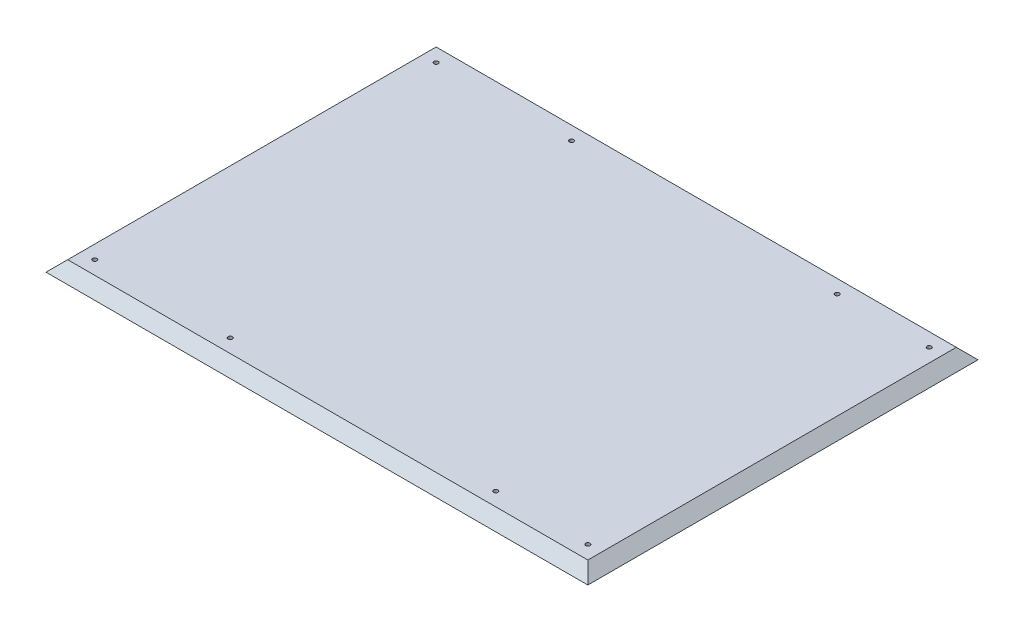
ISO-10303-21;
HEADER;
FILE_DESCRIPTION(('STEP AP214'),'2;1');
FILE_NAME('part.step','',(''),(''),'','','');
FILE_SCHEMA(('AUTOMOTIVE_DESIGN { 1 0 10303 214 1 1 1 1 }'));
ENDSEC;
DATA;
#1=APPLICATION_CONTEXT('core data for automotive mechanical design processes');
#2=APPLICATION_PROTOCOL_DEFINITION('international standard','automotive_design',2000,#1);
#3=PRODUCT_CONTEXT('',#1,'mechanical');
#4=PRODUCT('Part','Part','',(#3));
#5=PRODUCT_RELATED_PRODUCT_CATEGORY('part','',(#4));
#6=PRODUCT_DEFINITION_FORMATION('','',#4);
#7=PRODUCT_DEFINITION_CONTEXT('part definition',#1,'design');
#8=PRODUCT_DEFINITION('design','',#6,#7);
#9=PRODUCT_DEFINITION_SHAPE('','',#8);
#10=(LENGTH_UNIT() NAMED_UNIT(*) SI_UNIT(.MILLI.,.METRE.));
#11=(NAMED_UNIT(*) PLANE_ANGLE_UNIT() SI_UNIT($,.RADIAN.));
#12=(NAMED_UNIT(*) SI_UNIT($,.STERADIAN.) SOLID_ANGLE_UNIT());
#13=UNCERTAINTY_MEASURE_WITH_UNIT(LENGTH_MEASURE(1.E-05),#10,'distance_accuracy_value','');
#14=(GEOMETRIC_REPRESENTATION_CONTEXT(3) GLOBAL_UNCERTAINTY_ASSIGNED_CONTEXT((#13)) GLOBAL_UNIT_ASSIGNED_CONTEXT((#10,
#11,#12)) REPRESENTATION_CONTEXT('',''));
#15=CARTESIAN_POINT('',(0.,0.,0.));
#16=DIRECTION('',(0.,0.,1.));
#17=DIRECTION('',(1.,0.,0.));
#18=AXIS2_PLACEMENT_3D('',#15,#16,#17);
#19=CARTESIAN_POINT('',(0.,20.,0.));
#20=DIRECTION('',(0.,1.,0.));
#21=DIRECTION('',(0.,0.,1.));
#22=AXIS2_PLACEMENT_3D('',#19,#20,#21);
#23=PLANE('',#22);
#24=CARTESIAN_POINT('',(-102.5,20.,-157.5));
#25=DIRECTION('',(0.,1.,0.));
#26=DIRECTION('',(0.,0.,1.));
#27=AXIS2_PLACEMENT_3D('',#24,#25,#26);
#28=CIRCLE('',#27,2.);
#29=CARTESIAN_POINT('',(-102.5,20.,-155.5));
#30=VERTEX_POINT('',#29);
#31=EDGE_CURVE('E324',#30,#30,#28,.T.);
#32=ORIENTED_EDGE('',*,*,#31,.F.);
#33=EDGE_LOOP('',(#32));
#34=FACE_BOUND('',#33,.T.);
#35=CARTESIAN_POINT('',(142.5,20.,-157.5));
#36=DIRECTION('',(0.,1.,0.));
#37=DIRECTION('',(0.,0.,1.));
#38=AXIS2_PLACEMENT_3D('',#35,#36,#37);
#39=CIRCLE('',#38,2.);
#40=CARTESIAN_POINT('',(142.5,20.,-155.5));
#41=VERTEX_POINT('',#40);
#42=EDGE_CURVE('E329',#41,#41,#39,.T.);
#43=ORIENTED_EDGE('',*,*,#42,.F.);
#44=EDGE_LOOP('',(#43));
#45=FACE_BOUND('',#44,.T.);
#46=CARTESIAN_POINT('',(227.5,20.,-157.5));
#47=DIRECTION('',(0.,1.,0.));
#48=DIRECTION('',(0.,0.,1.));
#49=AXIS2_PLACEMENT_3D('',#46,#47,#48);
#50=CIRCLE('',#49,2.);
#51=CARTESIAN_POINT('',(227.5,20.,-155.5));
#52=VERTEX_POINT('',#51);
#53=EDGE_CURVE('E337',#52,#52,#50,.T.);
#54=ORIENTED_EDGE('',*,*,#53,.F.);
#55=EDGE_LOOP('',(#54));
#56=FACE_BOUND('',#55,.T.);
#57=CARTESIAN_POINT('',(227.5,20.,157.5));
#58=DIRECTION('',(0.,1.,0.));
#59=DIRECTION('',(0.,0.,1.));
#60=AXIS2_PLACEMENT_3D('',#57,#58,#59);
#61=CIRCLE('',#60,2.);
#62=CARTESIAN_POINT('',(227.5,20.,159.5));
#63=VERTEX_POINT('',#62);
#64=EDGE_CURVE('E343',#63,#63,#61,.T.);
#65=ORIENTED_EDGE('',*,*,#64,.F.);
#66=EDGE_LOOP('',(#65));
#67=FACE_BOUND('',#66,.T.);
#68=CARTESIAN_POINT('',(142.5,20.,157.5));
#69=DIRECTION('',(0.,1.,0.));
#70=DIRECTION('',(0.,0.,1.));
#71=AXIS2_PLACEMENT_3D('',#68,#69,#70);
#72=CIRCLE('',#71,2.);
#73=CARTESIAN_POINT('',(142.5,20.,159.5));
#74=VERTEX_POINT('',#73);
#75=EDGE_CURVE('E349',#74,#74,#72,.T.);
#76=ORIENTED_EDGE('',*,*,#75,.F.);
#77=EDGE_LOOP('',(#76));
#78=FACE_BOUND('',#77,.T.);
#79=CARTESIAN_POINT('',(-102.5,20.,157.5));
#80=DIRECTION('',(0.,1.,0.));
#81=DIRECTION('',(0.,0.,1.));
#82=AXIS2_PLACEMENT_3D('',#79,#80,#81);
#83=CIRCLE('',#82,2.);
#84=CARTESIAN_POINT('',(-102.5,20.,159.5));
#85=VERTEX_POINT('',#84);
#86=EDGE_CURVE('E355',#85,#85,#83,.T.);
#87=ORIENTED_EDGE('',*,*,#86,.F.);
#88=EDGE_LOOP('',(#87));
#89=FACE_BOUND('',#88,.T.);
#90=CARTESIAN_POINT('',(-227.5,20.,157.5));
#91=DIRECTION('',(0.,1.,0.));
#92=DIRECTION('',(0.,0.,1.));
#93=AXIS2_PLACEMENT_3D('',#90,#91,#92);
#94=CIRCLE('',#93,2.);
#95=CARTESIAN_POINT('',(-227.5,20.,159.5));
#96=VERTEX_POINT('',#95);
#97=EDGE_CURVE('E361',#96,#96,#94,.T.);
#98=ORIENTED_EDGE('',*,*,#97,.F.);
#99=EDGE_LOOP('',(#98));
#100=FACE_BOUND('',#99,.T.);
#101=CARTESIAN_POINT('',(-227.5,20.,-157.5));
#102=DIRECTION('',(0.,1.,0.));
#103=DIRECTION('',(0.,0.,1.));
#104=AXIS2_PLACEMENT_3D('',#101,#102,#103);
#105=CIRCLE('',#104,2.);
#106=CARTESIAN_POINT('',(-227.5,20.,-155.5));
#107=VERTEX_POINT('',#106);
#108=EDGE_CURVE('E143',#107,#107,#105,.T.);
#109=ORIENTED_EDGE('',*,*,#108,.F.);
#110=EDGE_LOOP('',(#109));
#111=FACE_BOUND('',#110,.T.);
#112=DIRECTION('',(0.,0.,1.));
#113=VECTOR('',#112,1.);
#114=CARTESIAN_POINT('',(-240.,20.,180.));
#115=LINE('',#114,#113);
#116=CARTESIAN_POINT('',(-240.,20.,-170.));
#117=VERTEX_POINT('',#116);
#118=CARTESIAN_POINT('',(-240.,20.,170.));
#119=VERTEX_POINT('',#118);
#120=EDGE_CURVE('E42',#117,#119,#115,.T.);
#121=ORIENTED_EDGE('',*,*,#120,.T.);
#122=DIRECTION('',(1.,0.,0.));
#123=VECTOR('',#122,1.);
#124=CARTESIAN_POINT('',(250.,20.,170.));
#125=LINE('',#124,#123);
#126=CARTESIAN_POINT('',(240.,20.,170.));
#127=VERTEX_POINT('',#126);
#128=EDGE_CURVE('E11',#119,#127,#125,.T.);
#129=ORIENTED_EDGE('',*,*,#128,.T.);
#130=DIRECTION('',(0.,0.,-1.));
#131=VECTOR('',#130,1.);
#132=CARTESIAN_POINT('',(240.,20.,-180.));
#133=LINE('',#132,#131);
#134=CARTESIAN_POINT('',(240.,20.,-170.));
#135=VERTEX_POINT('',#134);
#136=EDGE_CURVE('E92',#127,#135,#133,.T.);
#137=ORIENTED_EDGE('',*,*,#136,.T.);
#138=DIRECTION('',(-1.,0.,0.));
#139=VECTOR('',#138,1.);
#140=CARTESIAN_POINT('',(-250.,20.,-170.));
#141=LINE('',#140,#139);
#142=EDGE_CURVE('E95',#135,#117,#141,.T.);
#143=ORIENTED_EDGE('',*,*,#142,.T.);
#144=EDGE_LOOP('',(#121,#129,#137,#143));
#145=FACE_BOUND('',#144,.T.);
#146=ADVANCED_FACE('F32',(#34,#45,#56,#67,#78,#89,#100,#111,#145),#23,.T.);
#147=CARTESIAN_POINT('',(0.,0.,0.));
#148=DIRECTION('',(0.,1.,0.));
#149=DIRECTION('',(0.,0.,1.));
#150=AXIS2_PLACEMENT_3D('',#147,#148,#149);
#151=PLANE('',#150);
#152=CARTESIAN_POINT('',(-102.5,0.,-157.5));
#153=DIRECTION('',(0.,1.,0.));
#154=DIRECTION('',(0.,0.,1.));
#155=AXIS2_PLACEMENT_3D('',#152,#153,#154);
#156=CIRCLE('',#155,2.);
#157=CARTESIAN_POINT('',(-102.5,0.,-155.5));
#158=VERTEX_POINT('',#157);
#159=EDGE_CURVE('E322',#158,#158,#156,.T.);
#160=ORIENTED_EDGE('',*,*,#159,.T.);
#161=EDGE_LOOP('',(#160));
#162=FACE_BOUND('',#161,.T.);
#163=CARTESIAN_POINT('',(142.5,0.,-157.5));
#164=DIRECTION('',(0.,1.,0.));
#165=DIRECTION('',(0.,0.,1.));
#166=AXIS2_PLACEMENT_3D('',#163,#164,#165);
#167=CIRCLE('',#166,2.);
#168=CARTESIAN_POINT('',(142.5,0.,-155.5));
#169=VERTEX_POINT('',#168);
#170=EDGE_CURVE('E325',#169,#169,#167,.T.);
#171=ORIENTED_EDGE('',*,*,#170,.T.);
#172=EDGE_LOOP('',(#171));
#173=FACE_BOUND('',#172,.T.);
#174=CARTESIAN_POINT('',(227.5,0.,-157.5));
#175=DIRECTION('',(0.,1.,0.));
#176=DIRECTION('',(0.,0.,1.));
#177=AXIS2_PLACEMENT_3D('',#174,#175,#176);
#178=CIRCLE('',#177,2.);
#179=CARTESIAN_POINT('',(227.5,0.,-155.5));
#180=VERTEX_POINT('',#179);
#181=EDGE_CURVE('E334',#180,#180,#178,.T.);
#182=ORIENTED_EDGE('',*,*,#181,.T.);
#183=EDGE_LOOP('',(#182));
#184=FACE_BOUND('',#183,.T.);
#185=CARTESIAN_POINT('',(227.5,0.,157.5));
#186=DIRECTION('',(0.,1.,0.));
#187=DIRECTION('',(0.,0.,1.));
#188=AXIS2_PLACEMENT_3D('',#185,#186,#187);
#189=CIRCLE('',#188,2.);
#190=CARTESIAN_POINT('',(227.5,0.,159.5));
#191=VERTEX_POINT('',#190);
#192=EDGE_CURVE('E340',#191,#191,#189,.T.);
#193=ORIENTED_EDGE('',*,*,#192,.T.);
#194=EDGE_LOOP('',(#193));
#195=FACE_BOUND('',#194,.T.);
#196=CARTESIAN_POINT('',(142.5,0.,157.5));
#197=DIRECTION('',(0.,1.,0.));
#198=DIRECTION('',(0.,0.,1.));
#199=AXIS2_PLACEMENT_3D('',#196,#197,#198);
#200=CIRCLE('',#199,2.);
#201=CARTESIAN_POINT('',(142.5,0.,159.5));
#202=VERTEX_POINT('',#201);
#203=EDGE_CURVE('E346',#202,#202,#200,.T.);
#204=ORIENTED_EDGE('',*,*,#203,.T.);
#205=EDGE_LOOP('',(#204));
#206=FACE_BOUND('',#205,.T.);
#207=CARTESIAN_POINT('',(-102.5,0.,157.5));
#208=DIRECTION('',(0.,1.,0.));
#209=DIRECTION('',(0.,0.,1.));
#210=AXIS2_PLACEMENT_3D('',#207,#208,#209);
#211=CIRCLE('',#210,2.);
#212=CARTESIAN_POINT('',(-102.5,0.,159.5));
#213=VERTEX_POINT('',#212);
#214=EDGE_CURVE('E352',#213,#213,#211,.T.);
#215=ORIENTED_EDGE('',*,*,#214,.T.);
#216=EDGE_LOOP('',(#215));
#217=FACE_BOUND('',#216,.T.);
#218=CARTESIAN_POINT('',(-227.5,0.,157.5));
#219=DIRECTION('',(0.,1.,0.));
#220=DIRECTION('',(0.,0.,1.));
#221=AXIS2_PLACEMENT_3D('',#218,#219,#220);
#222=CIRCLE('',#221,2.);
#223=CARTESIAN_POINT('',(-227.5,0.,159.5));
#224=VERTEX_POINT('',#223);
#225=EDGE_CURVE('E358',#224,#224,#222,.T.);
#226=ORIENTED_EDGE('',*,*,#225,.T.);
#227=EDGE_LOOP('',(#226));
#228=FACE_BOUND('',#227,.T.);
#229=CARTESIAN_POINT('',(-227.5,0.,-157.5));
#230=DIRECTION('',(0.,1.,0.));
#231=DIRECTION('',(0.,0.,1.));
#232=AXIS2_PLACEMENT_3D('',#229,#230,#231);
#233=CIRCLE('',#232,2.);
#234=CARTESIAN_POINT('',(-227.5,0.,-155.5));
#235=VERTEX_POINT('',#234);
#236=EDGE_CURVE('E117',#235,#235,#233,.T.);
#237=ORIENTED_EDGE('',*,*,#236,.T.);
#238=EDGE_LOOP('',(#237));
#239=FACE_BOUND('',#238,.T.);
#240=DIRECTION('',(0.,0.,-1.));
#241=VECTOR('',#240,1.);
#242=CARTESIAN_POINT('',(-240.,0.,0.));
#243=LINE('',#242,#241);
#244=CARTESIAN_POINT('',(-240.,0.,170.));
#245=VERTEX_POINT('',#244);
#246=CARTESIAN_POINT('',(-240.,0.,-170.));
#247=VERTEX_POINT('',#246);
#248=EDGE_CURVE('E140',#245,#247,#243,.T.);
#249=ORIENTED_EDGE('',*,*,#248,.T.);
#250=DIRECTION('',(1.,0.,0.));
#251=VECTOR('',#250,1.);
#252=CARTESIAN_POINT('',(0.,0.,-170.));
#253=LINE('',#252,#251);
#254=CARTESIAN_POINT('',(240.,0.,-170.));
#255=VERTEX_POINT('',#254);
#256=EDGE_CURVE('E96',#247,#255,#253,.T.);
#257=ORIENTED_EDGE('',*,*,#256,.T.);
#258=DIRECTION('',(0.,0.,1.));
#259=VECTOR('',#258,1.);
#260=CARTESIAN_POINT('',(240.,0.,0.));
#261=LINE('',#260,#259);
#262=CARTESIAN_POINT('',(240.,0.,170.));
#263=VERTEX_POINT('',#262);
#264=EDGE_CURVE('E134',#255,#263,#261,.T.);
#265=ORIENTED_EDGE('',*,*,#264,.T.);
#266=DIRECTION('',(-1.,0.,0.));
#267=VECTOR('',#266,1.);
#268=CARTESIAN_POINT('',(0.,0.,170.));
#269=LINE('',#268,#267);
#270=EDGE_CURVE('E135',#263,#245,#269,.T.);
#271=ORIENTED_EDGE('',*,*,#270,.T.);
#272=EDGE_LOOP('',(#249,#257,#265,#271));
#273=FACE_BOUND('',#272,.T.);
#274=ADVANCED_FACE('F146',(#162,#173,#184,#195,#206,#217,#228,#239,#273),#151,.F.);
#275=CARTESIAN_POINT('',(0.,20.,170.));
#276=DIRECTION('',(0.,0.707106781186549,0.707106781186545));
#277=DIRECTION('',(-1.,0.,0.));
#278=AXIS2_PLACEMENT_3D('',#275,#276,#277);
#279=PLANE('',#278);
#280=DIRECTION('',(0.577350269189629,-0.577350269189623,0.577350269189626));
#281=VECTOR('',#280,1.);
#282=CARTESIAN_POINT('',(183.333333333333,76.6666666666664,113.333333333333));
#283=LINE('',#282,#281);
#284=CARTESIAN_POINT('',(250.,10.,180.));
#285=VERTEX_POINT('',#284);
#286=EDGE_CURVE('E36',#127,#285,#283,.T.);
#287=ORIENTED_EDGE('',*,*,#286,.F.);
#288=ORIENTED_EDGE('',*,*,#128,.F.);
#289=DIRECTION('',(0.577350269189625,0.577350269189624,-0.577350269189628));
#290=VECTOR('',#289,1.);
#291=CARTESIAN_POINT('',(-183.333333333333,76.6666666666667,113.333333333333));
#292=LINE('',#291,#290);
#293=CARTESIAN_POINT('',(-250.,10.,180.));
#294=VERTEX_POINT('',#293);
#295=EDGE_CURVE('E65',#294,#119,#292,.T.);
#296=ORIENTED_EDGE('',*,*,#295,.F.);
#297=DIRECTION('',(-1.,0.,0.));
#298=VECTOR('',#297,1.);
#299=CARTESIAN_POINT('',(-250.,9.99999999999999,180.));
#300=LINE('',#299,#298);
#301=EDGE_CURVE('E131',#285,#294,#300,.T.);
#302=ORIENTED_EDGE('',*,*,#301,.F.);
#303=EDGE_LOOP('',(#287,#288,#296,#302));
#304=FACE_BOUND('',#303,.T.);
#305=ADVANCED_FACE('F34',(#304),#279,.T.);
#306=CARTESIAN_POINT('',(240.,20.,0.));
#307=DIRECTION('',(0.707106781186544,0.707106781186551,0.));
#308=DIRECTION('',(0.,0.,1.));
#309=AXIS2_PLACEMENT_3D('',#306,#307,#308);
#310=PLANE('',#309);
#311=ORIENTED_EDGE('',*,*,#136,.F.);
#312=ORIENTED_EDGE('',*,*,#286,.T.);
#313=DIRECTION('',(0.,0.,1.));
#314=VECTOR('',#313,1.);
#315=CARTESIAN_POINT('',(250.,9.99999999999999,180.));
#316=LINE('',#315,#314);
#317=CARTESIAN_POINT('',(250.,10.,-180.));
#318=VERTEX_POINT('',#317);
#319=EDGE_CURVE('E102',#318,#285,#316,.T.);
#320=ORIENTED_EDGE('',*,*,#319,.F.);
#321=DIRECTION('',(-0.577350269189628,0.577350269189623,0.577350269189626));
#322=VECTOR('',#321,1.);
#323=CARTESIAN_POINT('',(183.333333333333,76.6666666666664,-113.333333333333));
#324=LINE('',#323,#322);
#325=EDGE_CURVE('E99',#135,#318,#324,.F.);
#326=ORIENTED_EDGE('',*,*,#325,.F.);
#327=EDGE_LOOP('',(#311,#312,#320,#326));
#328=FACE_BOUND('',#327,.T.);
#329=ADVANCED_FACE('F100',(#328),#310,.T.);
#330=CARTESIAN_POINT('',(-240.,20.,0.));
#331=DIRECTION('',(-0.707106781186547,0.707106781186548,0.));
#332=DIRECTION('',(0.,0.,-1.));
#333=AXIS2_PLACEMENT_3D('',#330,#331,#332);
#334=PLANE('',#333);
#335=ORIENTED_EDGE('',*,*,#295,.T.);
#336=ORIENTED_EDGE('',*,*,#120,.F.);
#337=DIRECTION('',(0.577350269189625,0.577350269189624,0.577350269189628));
#338=VECTOR('',#337,1.);
#339=CARTESIAN_POINT('',(-160.,99.9999999999997,-89.9999999999998));
#340=LINE('',#339,#338);
#341=CARTESIAN_POINT('',(-250.,10.,-180.));
#342=VERTEX_POINT('',#341);
#343=EDGE_CURVE('E105',#342,#117,#340,.T.);
#344=ORIENTED_EDGE('',*,*,#343,.F.);
#345=DIRECTION('',(0.,0.,-1.));
#346=VECTOR('',#345,1.);
#347=CARTESIAN_POINT('',(-250.,9.99999999999999,-180.));
#348=LINE('',#347,#346);
#349=EDGE_CURVE('E123',#294,#342,#348,.T.);
#350=ORIENTED_EDGE('',*,*,#349,.F.);
#351=EDGE_LOOP('',(#335,#336,#344,#350));
#352=FACE_BOUND('',#351,.T.);
#353=ADVANCED_FACE('F153',(#352),#334,.T.);
#354=CARTESIAN_POINT('',(-250.,10.,180.));
#355=DIRECTION('',(0.,0.707106781186549,-0.707106781186547));
#356=DIRECTION('',(1.,0.,0.));
#357=AXIS2_PLACEMENT_3D('',#354,#355,#356);
#358=PLANE('',#357);
#359=DIRECTION('',(0.577350269189626,-0.577350269189625,-0.577350269189627));
#360=VECTOR('',#359,1.);
#361=CARTESIAN_POINT('',(-250.,10.,180.));
#362=LINE('',#361,#360);
#363=EDGE_CURVE('E120',#245,#294,#362,.F.);
#364=ORIENTED_EDGE('',*,*,#363,.F.);
#365=ORIENTED_EDGE('',*,*,#270,.F.);
#366=DIRECTION('',(-0.577350269189627,-0.577350269189624,-0.577350269189626));
#367=VECTOR('',#366,1.);
#368=CARTESIAN_POINT('',(130.,-110.,59.9999999999999));
#369=LINE('',#368,#367);
#370=EDGE_CURVE('E128',#285,#263,#369,.T.);
#371=ORIENTED_EDGE('',*,*,#370,.F.);
#372=ORIENTED_EDGE('',*,*,#301,.T.);
#373=EDGE_LOOP('',(#364,#365,#371,#372));
#374=FACE_BOUND('',#373,.T.);
#375=ADVANCED_FACE('F155',(#374),#358,.F.);
#376=CARTESIAN_POINT('',(250.,10.,-180.));
#377=DIRECTION('',(-0.707106781186546,0.707106781186549,0.));
#378=DIRECTION('',(0.,0.,-1.));
#379=AXIS2_PLACEMENT_3D('',#376,#377,#378);
#380=PLANE('',#379);
#381=ORIENTED_EDGE('',*,*,#370,.T.);
#382=ORIENTED_EDGE('',*,*,#264,.F.);
#383=DIRECTION('',(0.577350269189627,0.577350269189625,-0.577350269189626));
#384=VECTOR('',#383,1.);
#385=CARTESIAN_POINT('',(250.,10.,-180.));
#386=LINE('',#385,#384);
#387=EDGE_CURVE('E79',#318,#255,#386,.F.);
#388=ORIENTED_EDGE('',*,*,#387,.F.);
#389=ORIENTED_EDGE('',*,*,#319,.T.);
#390=EDGE_LOOP('',(#381,#382,#388,#389));
#391=FACE_BOUND('',#390,.T.);
#392=ADVANCED_FACE('F161',(#391),#380,.F.);
#393=CARTESIAN_POINT('',(0.,20.,-170.));
#394=DIRECTION('',(0.,0.707106781186549,-0.707106781186545));
#395=DIRECTION('',(1.,0.,0.));
#396=AXIS2_PLACEMENT_3D('',#393,#394,#395);
#397=PLANE('',#396);
#398=ORIENTED_EDGE('',*,*,#142,.F.);
#399=ORIENTED_EDGE('',*,*,#325,.T.);
#400=DIRECTION('',(1.,0.,0.));
#401=VECTOR('',#400,1.);
#402=CARTESIAN_POINT('',(250.,9.99999999999999,-180.));
#403=LINE('',#402,#401);
#404=EDGE_CURVE('E116',#342,#318,#403,.T.);
#405=ORIENTED_EDGE('',*,*,#404,.F.);
#406=ORIENTED_EDGE('',*,*,#343,.T.);
#407=EDGE_LOOP('',(#398,#399,#405,#406));
#408=FACE_BOUND('',#407,.T.);
#409=ADVANCED_FACE('F108',(#408),#397,.T.);
#410=CARTESIAN_POINT('',(-250.,10.,-180.));
#411=DIRECTION('',(0.707106781186547,0.707106781186548,0.));
#412=DIRECTION('',(0.,0.,1.));
#413=AXIS2_PLACEMENT_3D('',#410,#411,#412);
#414=PLANE('',#413);
#415=ORIENTED_EDGE('',*,*,#363,.T.);
#416=ORIENTED_EDGE('',*,*,#349,.T.);
#417=DIRECTION('',(0.577350269189626,-0.577350269189625,0.577350269189627));
#418=VECTOR('',#417,1.);
#419=CARTESIAN_POINT('',(-250.,10.,-180.));
#420=LINE('',#419,#418);
#421=EDGE_CURVE('E113',#247,#342,#420,.F.);
#422=ORIENTED_EDGE('',*,*,#421,.F.);
#423=ORIENTED_EDGE('',*,*,#248,.F.);
#424=EDGE_LOOP('',(#415,#416,#422,#423));
#425=FACE_BOUND('',#424,.T.);
#426=ADVANCED_FACE('F151',(#425),#414,.F.);
#427=CARTESIAN_POINT('',(-250.,10.,-180.));
#428=DIRECTION('',(0.,0.707106781186549,0.707106781186547));
#429=DIRECTION('',(-1.,0.,0.));
#430=AXIS2_PLACEMENT_3D('',#427,#428,#429);
#431=PLANE('',#430);
#432=ORIENTED_EDGE('',*,*,#387,.T.);
#433=ORIENTED_EDGE('',*,*,#256,.F.);
#434=ORIENTED_EDGE('',*,*,#421,.T.);
#435=ORIENTED_EDGE('',*,*,#404,.T.);
#436=EDGE_LOOP('',(#432,#433,#434,#435));
#437=FACE_BOUND('',#436,.T.);
#438=ADVANCED_FACE('F149',(#437),#431,.F.);
#439=CARTESIAN_POINT('',(-227.5,0.,-157.5));
#440=DIRECTION('',(0.,1.,0.));
#441=DIRECTION('',(0.,0.,1.));
#442=AXIS2_PLACEMENT_3D('',#439,#440,#441);
#443=CYLINDRICAL_SURFACE('',#442,2.);
#444=ORIENTED_EDGE('',*,*,#236,.F.);
#445=EDGE_LOOP('',(#444));
#446=FACE_BOUND('',#445,.T.);
#447=ORIENTED_EDGE('',*,*,#108,.T.);
#448=EDGE_LOOP('',(#447));
#449=FACE_BOUND('',#448,.T.);
#450=ADVANCED_FACE('F175',(#446,#449),#443,.F.);
#451=CARTESIAN_POINT('',(-227.5,0.,157.5));
#452=DIRECTION('',(0.,1.,0.));
#453=DIRECTION('',(0.,0.,1.));
#454=AXIS2_PLACEMENT_3D('',#451,#452,#453);
#455=CYLINDRICAL_SURFACE('',#454,2.);
#456=ORIENTED_EDGE('',*,*,#225,.F.);
#457=EDGE_LOOP('',(#456));
#458=FACE_BOUND('',#457,.T.);
#459=ORIENTED_EDGE('',*,*,#97,.T.);
#460=EDGE_LOOP('',(#459));
#461=FACE_BOUND('',#460,.T.);
#462=ADVANCED_FACE('F247',(#458,#461),#455,.F.);
#463=CARTESIAN_POINT('',(-102.5,0.,157.5));
#464=DIRECTION('',(0.,1.,0.));
#465=DIRECTION('',(0.,0.,1.));
#466=AXIS2_PLACEMENT_3D('',#463,#464,#465);
#467=CYLINDRICAL_SURFACE('',#466,2.);
#468=ORIENTED_EDGE('',*,*,#214,.F.);
#469=EDGE_LOOP('',(#468));
#470=FACE_BOUND('',#469,.T.);
#471=ORIENTED_EDGE('',*,*,#86,.T.);
#472=EDGE_LOOP('',(#471));
#473=FACE_BOUND('',#472,.T.);
#474=ADVANCED_FACE('F256',(#470,#473),#467,.F.);
#475=CARTESIAN_POINT('',(142.5,0.,157.5));
#476=DIRECTION('',(0.,1.,0.));
#477=DIRECTION('',(0.,0.,1.));
#478=AXIS2_PLACEMENT_3D('',#475,#476,#477);
#479=CYLINDRICAL_SURFACE('',#478,2.);
#480=ORIENTED_EDGE('',*,*,#203,.F.);
#481=EDGE_LOOP('',(#480));
#482=FACE_BOUND('',#481,.T.);
#483=ORIENTED_EDGE('',*,*,#75,.T.);
#484=EDGE_LOOP('',(#483));
#485=FACE_BOUND('',#484,.T.);
#486=ADVANCED_FACE('F265',(#482,#485),#479,.F.);
#487=CARTESIAN_POINT('',(227.5,0.,157.5));
#488=DIRECTION('',(0.,1.,0.));
#489=DIRECTION('',(0.,0.,1.));
#490=AXIS2_PLACEMENT_3D('',#487,#488,#489);
#491=CYLINDRICAL_SURFACE('',#490,2.);
#492=ORIENTED_EDGE('',*,*,#192,.F.);
#493=EDGE_LOOP('',(#492));
#494=FACE_BOUND('',#493,.T.);
#495=ORIENTED_EDGE('',*,*,#64,.T.);
#496=EDGE_LOOP('',(#495));
#497=FACE_BOUND('',#496,.T.);
#498=ADVANCED_FACE('F275',(#494,#497),#491,.F.);
#499=CARTESIAN_POINT('',(227.5,0.,-157.5));
#500=DIRECTION('',(0.,1.,0.));
#501=DIRECTION('',(0.,0.,1.));
#502=AXIS2_PLACEMENT_3D('',#499,#500,#501);
#503=CYLINDRICAL_SURFACE('',#502,2.);
#504=ORIENTED_EDGE('',*,*,#181,.F.);
#505=EDGE_LOOP('',(#504));
#506=FACE_BOUND('',#505,.T.);
#507=ORIENTED_EDGE('',*,*,#53,.T.);
#508=EDGE_LOOP('',(#507));
#509=FACE_BOUND('',#508,.T.);
#510=ADVANCED_FACE('F285',(#506,#509),#503,.F.);
#511=CARTESIAN_POINT('',(142.5,0.,-157.5));
#512=DIRECTION('',(0.,1.,0.));
#513=DIRECTION('',(0.,0.,1.));
#514=AXIS2_PLACEMENT_3D('',#511,#512,#513);
#515=CYLINDRICAL_SURFACE('',#514,2.);
#516=ORIENTED_EDGE('',*,*,#170,.F.);
#517=EDGE_LOOP('',(#516));
#518=FACE_BOUND('',#517,.T.);
#519=ORIENTED_EDGE('',*,*,#42,.T.);
#520=EDGE_LOOP('',(#519));
#521=FACE_BOUND('',#520,.T.);
#522=ADVANCED_FACE('F295',(#518,#521),#515,.F.);
#523=CARTESIAN_POINT('',(-102.5,0.,-157.5));
#524=DIRECTION('',(0.,1.,0.));
#525=DIRECTION('',(0.,0.,1.));
#526=AXIS2_PLACEMENT_3D('',#523,#524,#525);
#527=CYLINDRICAL_SURFACE('',#526,2.);
#528=ORIENTED_EDGE('',*,*,#159,.F.);
#529=EDGE_LOOP('',(#528));
#530=FACE_BOUND('',#529,.T.);
#531=ORIENTED_EDGE('',*,*,#31,.T.);
#532=EDGE_LOOP('',(#531));
#533=FACE_BOUND('',#532,.T.);
#534=ADVANCED_FACE('F305',(#530,#533),#527,.F.);
#535=CLOSED_SHELL('',(#146,#274,#305,#329,#353,#375,#392,#409,#426,#438,#450,#462,#474,#486,
#498,#510,#522,#534));
#536=MANIFOLD_SOLID_BREP('B2',#535);
#537=ADVANCED_BREP_SHAPE_REPRESENTATION('',(#18,#536),#14);
#538=SHAPE_DEFINITION_REPRESENTATION(#9,#537);
ENDSEC;
END-ISO-10303-21;
